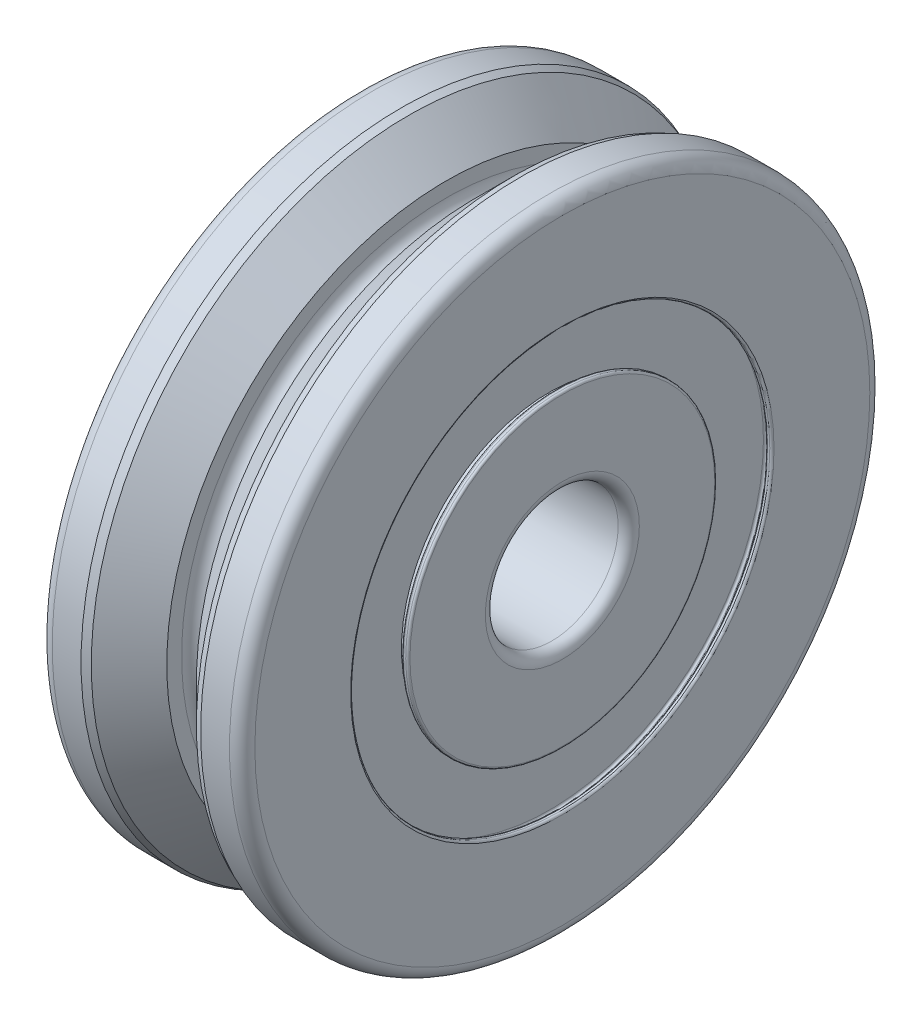
ISO-10303-21;
HEADER;
FILE_DESCRIPTION(('STEP AP214'),'2;1');
FILE_NAME('part.step','',(''),(''),'','','');
FILE_SCHEMA(('AUTOMOTIVE_DESIGN { 1 0 10303 214 1 1 1 1 }'));
ENDSEC;
DATA;
#1=APPLICATION_CONTEXT('core data for automotive mechanical design processes');
#2=APPLICATION_PROTOCOL_DEFINITION('international standard','automotive_design',2000,#1);
#3=PRODUCT_CONTEXT('',#1,'mechanical');
#4=PRODUCT('Part','Part','',(#3));
#5=PRODUCT_RELATED_PRODUCT_CATEGORY('part','',(#4));
#6=PRODUCT_DEFINITION_FORMATION('','',#4);
#7=PRODUCT_DEFINITION_CONTEXT('part definition',#1,'design');
#8=PRODUCT_DEFINITION('design','',#6,#7);
#9=PRODUCT_DEFINITION_SHAPE('','',#8);
#10=(LENGTH_UNIT() NAMED_UNIT(*) SI_UNIT(.MILLI.,.METRE.));
#11=(NAMED_UNIT(*) PLANE_ANGLE_UNIT() SI_UNIT($,.RADIAN.));
#12=(NAMED_UNIT(*) SI_UNIT($,.STERADIAN.) SOLID_ANGLE_UNIT());
#13=UNCERTAINTY_MEASURE_WITH_UNIT(LENGTH_MEASURE(1.E-05),#10,'distance_accuracy_value','');
#14=(GEOMETRIC_REPRESENTATION_CONTEXT(3) GLOBAL_UNCERTAINTY_ASSIGNED_CONTEXT((#13)) GLOBAL_UNIT_ASSIGNED_CONTEXT((#10,
#11,#12)) REPRESENTATION_CONTEXT('',''));
#15=CARTESIAN_POINT('',(0.,0.,0.));
#16=DIRECTION('',(0.,0.,1.));
#17=DIRECTION('',(1.,0.,0.));
#18=AXIS2_PLACEMENT_3D('',#15,#16,#17);
#19=CARTESIAN_POINT('',(-4.76250000000015,0.,0.));
#20=DIRECTION('',(1.,0.,0.));
#21=DIRECTION('',(0.,0.,-1.));
#22=AXIS2_PLACEMENT_3D('',#19,#20,#21);
#23=TOROIDAL_SURFACE('',#22,7.3152,0.101599999999924);
#24=CARTESIAN_POINT('',(-4.8641,0.,0.));
#25=DIRECTION('',(1.,0.,0.));
#26=DIRECTION('',(0.,0.,-1.));
#27=AXIS2_PLACEMENT_3D('',#24,#25,#26);
#28=CIRCLE('',#27,7.3152);
#29=CARTESIAN_POINT('',(-4.8641,0.,-7.3152));
#30=VERTEX_POINT('',#29);
#31=EDGE_CURVE('E10',#30,#30,#28,.T.);
#32=ORIENTED_EDGE('',*,*,#31,.T.);
#33=EDGE_LOOP('',(#32));
#34=FACE_BOUND('',#33,.T.);
#35=CARTESIAN_POINT('',(-4.7625,0.,0.));
#36=DIRECTION('',(1.,0.,0.));
#37=DIRECTION('',(0.,0.,-1.));
#38=AXIS2_PLACEMENT_3D('',#35,#36,#37);
#39=CIRCLE('',#38,7.4168);
#40=CARTESIAN_POINT('',(-4.7625,0.,-7.4168));
#41=VERTEX_POINT('',#40);
#42=EDGE_CURVE('E164',#41,#41,#39,.T.);
#43=ORIENTED_EDGE('',*,*,#42,.F.);
#44=EDGE_LOOP('',(#43));
#45=FACE_BOUND('',#44,.T.);
#46=ADVANCED_FACE('F34',(#34,#45),#23,.T.);
#47=CARTESIAN_POINT('',(-4.86410000000005,7.3152,0.));
#48=DIRECTION('',(-1.,0.,0.));
#49=DIRECTION('',(0.,0.,1.));
#50=AXIS2_PLACEMENT_3D('',#47,#48,#49);
#51=PLANE('',#50);
#52=CARTESIAN_POINT('',(-4.86410000000009,0.,0.));
#53=DIRECTION('',(1.,0.,0.));
#54=DIRECTION('',(0.,0.,-1.));
#55=AXIS2_PLACEMENT_3D('',#52,#53,#54);
#56=CIRCLE('',#55,3.6957);
#57=CARTESIAN_POINT('',(-4.86410000000009,0.,-3.6957));
#58=VERTEX_POINT('',#57);
#59=EDGE_CURVE('E40',#58,#58,#56,.T.);
#60=ORIENTED_EDGE('',*,*,#59,.T.);
#61=EDGE_LOOP('',(#60));
#62=FACE_BOUND('',#61,.T.);
#63=ORIENTED_EDGE('',*,*,#31,.F.);
#64=EDGE_LOOP('',(#63));
#65=FACE_BOUND('',#64,.T.);
#66=ADVANCED_FACE('F172',(#62,#65),#51,.T.);
#67=CARTESIAN_POINT('',(-4.35610000000013,0.,0.));
#68=DIRECTION('',(1.,0.,0.));
#69=DIRECTION('',(0.,0.,-1.));
#70=AXIS2_PLACEMENT_3D('',#67,#68,#69);
#71=TOROIDAL_SURFACE('',#70,3.6957,0.507999999999968);
#72=CARTESIAN_POINT('',(-4.3561,0.,0.));
#73=DIRECTION('',(1.,0.,0.));
#74=DIRECTION('',(0.,0.,-1.));
#75=AXIS2_PLACEMENT_3D('',#72,#73,#74);
#76=CIRCLE('',#75,3.1877);
#77=CARTESIAN_POINT('',(-4.3561,0.,-3.1877));
#78=VERTEX_POINT('',#77);
#79=EDGE_CURVE('E44',#78,#78,#76,.T.);
#80=ORIENTED_EDGE('',*,*,#79,.T.);
#81=EDGE_LOOP('',(#80));
#82=FACE_BOUND('',#81,.T.);
#83=ORIENTED_EDGE('',*,*,#59,.F.);
#84=EDGE_LOOP('',(#83));
#85=FACE_BOUND('',#84,.T.);
#86=ADVANCED_FACE('F176',(#82,#85),#71,.T.);
#87=CARTESIAN_POINT('',(-4.86410000000084,0.,0.));
#88=DIRECTION('',(1.,0.,0.));
#89=DIRECTION('',(0.,0.,-1.));
#90=AXIS2_PLACEMENT_3D('',#87,#88,#89);
#91=CYLINDRICAL_SURFACE('',#90,3.18770000000002);
#92=CARTESIAN_POINT('',(4.35609999999933,0.,0.));
#93=DIRECTION('',(1.,0.,0.));
#94=DIRECTION('',(0.,0.,-1.));
#95=AXIS2_PLACEMENT_3D('',#92,#93,#94);
#96=CIRCLE('',#95,3.18770000000003);
#97=CARTESIAN_POINT('',(4.35609999999933,0.,-3.18770000000003));
#98=VERTEX_POINT('',#97);
#99=EDGE_CURVE('E48',#98,#98,#96,.T.);
#100=ORIENTED_EDGE('',*,*,#99,.T.);
#101=EDGE_LOOP('',(#100));
#102=FACE_BOUND('',#101,.T.);
#103=ORIENTED_EDGE('',*,*,#79,.F.);
#104=EDGE_LOOP('',(#103));
#105=FACE_BOUND('',#104,.T.);
#106=ADVANCED_FACE('F180',(#102,#105),#91,.F.);
#107=CARTESIAN_POINT('',(4.35609999999933,0.,0.));
#108=DIRECTION('',(1.,0.,0.));
#109=DIRECTION('',(0.,0.,-1.));
#110=AXIS2_PLACEMENT_3D('',#107,#108,#109);
#111=TOROIDAL_SURFACE('',#110,3.69569999999997,0.507999999999936);
#112=CARTESIAN_POINT('',(4.86409999999927,0.,0.));
#113=DIRECTION('',(1.,0.,0.));
#114=DIRECTION('',(0.,0.,-1.));
#115=AXIS2_PLACEMENT_3D('',#112,#113,#114);
#116=CIRCLE('',#115,3.69569999999997);
#117=CARTESIAN_POINT('',(4.86409999999927,0.,-3.69569999999997));
#118=VERTEX_POINT('',#117);
#119=EDGE_CURVE('E53',#118,#118,#116,.T.);
#120=ORIENTED_EDGE('',*,*,#119,.T.);
#121=EDGE_LOOP('',(#120));
#122=FACE_BOUND('',#121,.T.);
#123=ORIENTED_EDGE('',*,*,#99,.F.);
#124=EDGE_LOOP('',(#123));
#125=FACE_BOUND('',#124,.T.);
#126=ADVANCED_FACE('F187',(#122,#125),#111,.T.);
#127=CARTESIAN_POINT('',(4.86409999999927,3.69569999999997,0.));
#128=DIRECTION('',(1.,0.,0.));
#129=DIRECTION('',(0.,0.,-1.));
#130=AXIS2_PLACEMENT_3D('',#127,#128,#129);
#131=PLANE('',#130);
#132=CARTESIAN_POINT('',(4.86409999999927,0.,0.));
#133=DIRECTION('',(1.,0.,0.));
#134=DIRECTION('',(0.,0.,-1.));
#135=AXIS2_PLACEMENT_3D('',#132,#133,#134);
#136=CIRCLE('',#135,7.31519999999992);
#137=CARTESIAN_POINT('',(4.86409999999927,0.,-7.31519999999992));
#138=VERTEX_POINT('',#137);
#139=EDGE_CURVE('E56',#138,#138,#136,.T.);
#140=ORIENTED_EDGE('',*,*,#139,.T.);
#141=EDGE_LOOP('',(#140));
#142=FACE_BOUND('',#141,.T.);
#143=ORIENTED_EDGE('',*,*,#119,.F.);
#144=EDGE_LOOP('',(#143));
#145=FACE_BOUND('',#144,.T.);
#146=ADVANCED_FACE('F191',(#142,#145),#131,.T.);
#147=CARTESIAN_POINT('',(4.76249999999927,0.,0.));
#148=DIRECTION('',(1.,0.,0.));
#149=DIRECTION('',(0.,0.,-1.));
#150=AXIS2_PLACEMENT_3D('',#147,#148,#149);
#151=TOROIDAL_SURFACE('',#150,7.31519999999992,0.101600000000001);
#152=CARTESIAN_POINT('',(4.76249999999927,0.,0.));
#153=DIRECTION('',(1.,0.,0.));
#154=DIRECTION('',(0.,0.,-1.));
#155=AXIS2_PLACEMENT_3D('',#152,#153,#154);
#156=CIRCLE('',#155,7.41679999999993);
#157=CARTESIAN_POINT('',(4.76249999999927,0.,-7.41679999999993));
#158=VERTEX_POINT('',#157);
#159=EDGE_CURVE('E59',#158,#158,#156,.T.);
#160=ORIENTED_EDGE('',*,*,#159,.T.);
#161=EDGE_LOOP('',(#160));
#162=FACE_BOUND('',#161,.T.);
#163=ORIENTED_EDGE('',*,*,#139,.F.);
#164=EDGE_LOOP('',(#163));
#165=FACE_BOUND('',#164,.T.);
#166=ADVANCED_FACE('F195',(#162,#165),#151,.T.);
#167=CARTESIAN_POINT('',(-4.86410000000084,0.,0.));
#168=DIRECTION('',(1.,0.,0.));
#169=DIRECTION('',(0.,0.,-1.));
#170=AXIS2_PLACEMENT_3D('',#167,#168,#169);
#171=CYLINDRICAL_SURFACE('',#170,7.41679999999996);
#172=CARTESIAN_POINT('',(4.6609,0.,0.));
#173=DIRECTION('',(1.,0.,0.));
#174=DIRECTION('',(0.,0.,-1.));
#175=AXIS2_PLACEMENT_3D('',#172,#173,#174);
#176=CIRCLE('',#175,7.4168);
#177=CARTESIAN_POINT('',(4.6609,0.,-7.4168));
#178=VERTEX_POINT('',#177);
#179=EDGE_CURVE('E62',#178,#178,#176,.T.);
#180=ORIENTED_EDGE('',*,*,#179,.T.);
#181=EDGE_LOOP('',(#180));
#182=FACE_BOUND('',#181,.T.);
#183=ORIENTED_EDGE('',*,*,#159,.F.);
#184=EDGE_LOOP('',(#183));
#185=FACE_BOUND('',#184,.T.);
#186=ADVANCED_FACE('F199',(#182,#185),#171,.T.);
#187=CARTESIAN_POINT('',(4.6609,0.,0.));
#188=DIRECTION('',(1.,0.,0.));
#189=DIRECTION('',(0.,0.,-1.));
#190=AXIS2_PLACEMENT_3D('',#187,#188,#189);
#191=TOROIDAL_SURFACE('',#190,7.3152,0.1016);
#192=CARTESIAN_POINT('',(4.5593,0.,0.));
#193=DIRECTION('',(1.,0.,0.));
#194=DIRECTION('',(0.,0.,-1.));
#195=AXIS2_PLACEMENT_3D('',#192,#193,#194);
#196=CIRCLE('',#195,7.3152);
#197=CARTESIAN_POINT('',(4.5593,0.,-7.3152));
#198=VERTEX_POINT('',#197);
#199=EDGE_CURVE('E65',#198,#198,#196,.T.);
#200=ORIENTED_EDGE('',*,*,#199,.T.);
#201=EDGE_LOOP('',(#200));
#202=FACE_BOUND('',#201,.T.);
#203=ORIENTED_EDGE('',*,*,#179,.F.);
#204=EDGE_LOOP('',(#203));
#205=FACE_BOUND('',#204,.T.);
#206=ADVANCED_FACE('F203',(#202,#205),#191,.T.);
#207=CARTESIAN_POINT('',(4.5593,7.3152,0.));
#208=DIRECTION('',(-1.,0.,0.));
#209=DIRECTION('',(0.,0.,1.));
#210=AXIS2_PLACEMENT_3D('',#207,#208,#209);
#211=PLANE('',#210);
#212=CARTESIAN_POINT('',(4.5593,0.,0.));
#213=DIRECTION('',(1.,0.,0.));
#214=DIRECTION('',(0.,0.,-1.));
#215=AXIS2_PLACEMENT_3D('',#212,#213,#214);
#216=CIRCLE('',#215,7.112);
#217=CARTESIAN_POINT('',(4.5593,0.,-7.112));
#218=VERTEX_POINT('',#217);
#219=EDGE_CURVE('E68',#218,#218,#216,.T.);
#220=ORIENTED_EDGE('',*,*,#219,.T.);
#221=EDGE_LOOP('',(#220));
#222=FACE_BOUND('',#221,.T.);
#223=ORIENTED_EDGE('',*,*,#199,.F.);
#224=EDGE_LOOP('',(#223));
#225=FACE_BOUND('',#224,.T.);
#226=ADVANCED_FACE('F207',(#222,#225),#211,.T.);
#227=CARTESIAN_POINT('',(-4.86410000000084,0.,0.));
#228=DIRECTION('',(1.,0.,0.));
#229=DIRECTION('',(0.,0.,-1.));
#230=AXIS2_PLACEMENT_3D('',#227,#228,#229);
#231=CYLINDRICAL_SURFACE('',#230,7.112);
#232=CARTESIAN_POINT('',(4.25449999999937,0.,0.));
#233=DIRECTION('',(1.,0.,0.));
#234=DIRECTION('',(0.,0.,-1.));
#235=AXIS2_PLACEMENT_3D('',#232,#233,#234);
#236=CIRCLE('',#235,7.112);
#237=CARTESIAN_POINT('',(4.25449999999937,0.,-7.112));
#238=VERTEX_POINT('',#237);
#239=EDGE_CURVE('E71',#238,#238,#236,.T.);
#240=ORIENTED_EDGE('',*,*,#239,.T.);
#241=EDGE_LOOP('',(#240));
#242=FACE_BOUND('',#241,.T.);
#243=ORIENTED_EDGE('',*,*,#219,.F.);
#244=EDGE_LOOP('',(#243));
#245=FACE_BOUND('',#244,.T.);
#246=ADVANCED_FACE('F211',(#242,#245),#231,.T.);
#247=CARTESIAN_POINT('',(4.25449999999937,7.112,0.));
#248=DIRECTION('',(1.,0.,0.));
#249=DIRECTION('',(0.,0.,-1.));
#250=AXIS2_PLACEMENT_3D('',#247,#248,#249);
#251=PLANE('',#250);
#252=CARTESIAN_POINT('',(4.25449999999937,0.,0.));
#253=DIRECTION('',(1.,0.,0.));
#254=DIRECTION('',(0.,0.,-1.));
#255=AXIS2_PLACEMENT_3D('',#252,#253,#254);
#256=CIRCLE('',#255,10.2616000000002);
#257=CARTESIAN_POINT('',(4.25449999999937,0.,-10.2616000000002));
#258=VERTEX_POINT('',#257);
#259=EDGE_CURVE('E74',#258,#258,#256,.T.);
#260=ORIENTED_EDGE('',*,*,#259,.T.);
#261=EDGE_LOOP('',(#260));
#262=FACE_BOUND('',#261,.T.);
#263=ORIENTED_EDGE('',*,*,#239,.F.);
#264=EDGE_LOOP('',(#263));
#265=FACE_BOUND('',#264,.T.);
#266=ADVANCED_FACE('F215',(#262,#265),#251,.T.);
#267=CARTESIAN_POINT('',(4.35609999999916,0.,0.));
#268=DIRECTION('',(1.,0.,0.));
#269=DIRECTION('',(0.,0.,-1.));
#270=AXIS2_PLACEMENT_3D('',#267,#268,#269);
#271=TOROIDAL_SURFACE('',#270,10.2616000000002,0.10159999999979);
#272=CARTESIAN_POINT('',(4.35609999999916,0.,0.));
#273=DIRECTION('',(1.,0.,0.));
#274=DIRECTION('',(0.,0.,-1.));
#275=AXIS2_PLACEMENT_3D('',#272,#273,#274);
#276=CIRCLE('',#275,10.3632);
#277=CARTESIAN_POINT('',(4.35609999999916,0.,-10.3632));
#278=VERTEX_POINT('',#277);
#279=EDGE_CURVE('E77',#278,#278,#276,.T.);
#280=ORIENTED_EDGE('',*,*,#279,.T.);
#281=EDGE_LOOP('',(#280));
#282=FACE_BOUND('',#281,.T.);
#283=ORIENTED_EDGE('',*,*,#259,.F.);
#284=EDGE_LOOP('',(#283));
#285=FACE_BOUND('',#284,.T.);
#286=ADVANCED_FACE('F219',(#282,#285),#271,.F.);
#287=CARTESIAN_POINT('',(-4.86410000000084,0.,0.));
#288=DIRECTION('',(1.,0.,0.));
#289=DIRECTION('',(0.,0.,-1.));
#290=AXIS2_PLACEMENT_3D('',#287,#288,#289);
#291=CYLINDRICAL_SURFACE('',#290,10.3632);
#292=CARTESIAN_POINT('',(4.5593,0.,0.));
#293=DIRECTION('',(1.,0.,0.));
#294=DIRECTION('',(0.,0.,-1.));
#295=AXIS2_PLACEMENT_3D('',#292,#293,#294);
#296=CIRCLE('',#295,10.3632);
#297=CARTESIAN_POINT('',(4.5593,0.,-10.3632));
#298=VERTEX_POINT('',#297);
#299=EDGE_CURVE('E80',#298,#298,#296,.T.);
#300=ORIENTED_EDGE('',*,*,#299,.T.);
#301=EDGE_LOOP('',(#300));
#302=FACE_BOUND('',#301,.T.);
#303=ORIENTED_EDGE('',*,*,#279,.F.);
#304=EDGE_LOOP('',(#303));
#305=FACE_BOUND('',#304,.T.);
#306=ADVANCED_FACE('F223',(#302,#305),#291,.F.);
#307=CARTESIAN_POINT('',(4.5593,10.3632,0.));
#308=DIRECTION('',(-1.,0.,0.));
#309=DIRECTION('',(0.,0.,1.));
#310=AXIS2_PLACEMENT_3D('',#307,#308,#309);
#311=PLANE('',#310);
#312=CARTESIAN_POINT('',(4.5593,0.,0.));
#313=DIRECTION('',(1.,0.,0.));
#314=DIRECTION('',(0.,0.,-1.));
#315=AXIS2_PLACEMENT_3D('',#312,#313,#314);
#316=CIRCLE('',#315,10.16);
#317=CARTESIAN_POINT('',(4.5593,0.,-10.16));
#318=VERTEX_POINT('',#317);
#319=EDGE_CURVE('E83',#318,#318,#316,.T.);
#320=ORIENTED_EDGE('',*,*,#319,.T.);
#321=EDGE_LOOP('',(#320));
#322=FACE_BOUND('',#321,.T.);
#323=ORIENTED_EDGE('',*,*,#299,.F.);
#324=EDGE_LOOP('',(#323));
#325=FACE_BOUND('',#324,.T.);
#326=ADVANCED_FACE('F227',(#322,#325),#311,.T.);
#327=CARTESIAN_POINT('',(4.66089999999979,0.,0.));
#328=DIRECTION('',(1.,0.,0.));
#329=DIRECTION('',(0.,0.,-1.));
#330=AXIS2_PLACEMENT_3D('',#327,#328,#329);
#331=TOROIDAL_SURFACE('',#330,10.16,0.10159999999979);
#332=CARTESIAN_POINT('',(4.66089999999979,0.,0.));
#333=DIRECTION('',(1.,0.,0.));
#334=DIRECTION('',(0.,0.,-1.));
#335=AXIS2_PLACEMENT_3D('',#332,#333,#334);
#336=CIRCLE('',#335,10.0584000000002);
#337=CARTESIAN_POINT('',(4.66089999999979,0.,-10.0584000000002));
#338=VERTEX_POINT('',#337);
#339=EDGE_CURVE('E86',#338,#338,#336,.T.);
#340=ORIENTED_EDGE('',*,*,#339,.T.);
#341=EDGE_LOOP('',(#340));
#342=FACE_BOUND('',#341,.T.);
#343=ORIENTED_EDGE('',*,*,#319,.F.);
#344=EDGE_LOOP('',(#343));
#345=FACE_BOUND('',#344,.T.);
#346=ADVANCED_FACE('F231',(#342,#345),#331,.T.);
#347=CARTESIAN_POINT('',(-4.86410000000084,0.,0.));
#348=DIRECTION('',(1.,0.,0.));
#349=DIRECTION('',(0.,0.,-1.));
#350=AXIS2_PLACEMENT_3D('',#347,#348,#349);
#351=CYLINDRICAL_SURFACE('',#350,10.0584000000002);
#352=CARTESIAN_POINT('',(4.76249999999969,0.,0.));
#353=DIRECTION('',(1.,0.,0.));
#354=DIRECTION('',(0.,0.,-1.));
#355=AXIS2_PLACEMENT_3D('',#352,#353,#354);
#356=CIRCLE('',#355,10.0584000000002);
#357=CARTESIAN_POINT('',(4.76249999999969,0.,-10.0584000000002));
#358=VERTEX_POINT('',#357);
#359=EDGE_CURVE('E89',#358,#358,#356,.T.);
#360=ORIENTED_EDGE('',*,*,#359,.T.);
#361=EDGE_LOOP('',(#360));
#362=FACE_BOUND('',#361,.T.);
#363=ORIENTED_EDGE('',*,*,#339,.F.);
#364=EDGE_LOOP('',(#363));
#365=FACE_BOUND('',#364,.T.);
#366=ADVANCED_FACE('F235',(#362,#365),#351,.F.);
#367=CARTESIAN_POINT('',(4.76249999999969,0.,0.));
#368=DIRECTION('',(1.,0.,0.));
#369=DIRECTION('',(0.,0.,-1.));
#370=AXIS2_PLACEMENT_3D('',#367,#368,#369);
#371=TOROIDAL_SURFACE('',#370,10.1599999999998,0.10159999999958);
#372=CARTESIAN_POINT('',(4.86409999999927,0.,0.));
#373=DIRECTION('',(1.,0.,0.));
#374=DIRECTION('',(0.,0.,-1.));
#375=AXIS2_PLACEMENT_3D('',#372,#373,#374);
#376=CIRCLE('',#375,10.1599999999998);
#377=CARTESIAN_POINT('',(4.86409999999927,0.,-10.1599999999998));
#378=VERTEX_POINT('',#377);
#379=EDGE_CURVE('E92',#378,#378,#376,.T.);
#380=ORIENTED_EDGE('',*,*,#379,.T.);
#381=EDGE_LOOP('',(#380));
#382=FACE_BOUND('',#381,.T.);
#383=ORIENTED_EDGE('',*,*,#359,.F.);
#384=EDGE_LOOP('',(#383));
#385=FACE_BOUND('',#384,.T.);
#386=ADVANCED_FACE('F239',(#382,#385),#371,.T.);
#387=CARTESIAN_POINT('',(4.86409999999927,10.1599999999998,0.));
#388=DIRECTION('',(1.,0.,0.));
#389=DIRECTION('',(0.,0.,-1.));
#390=AXIS2_PLACEMENT_3D('',#387,#388,#389);
#391=PLANE('',#390);
#392=CARTESIAN_POINT('',(4.86409999999927,0.,0.));
#393=DIRECTION('',(1.,0.,0.));
#394=DIRECTION('',(0.,0.,-1.));
#395=AXIS2_PLACEMENT_3D('',#392,#393,#394);
#396=CIRCLE('',#395,14.7574000000001);
#397=CARTESIAN_POINT('',(4.86409999999927,0.,-14.7574000000001));
#398=VERTEX_POINT('',#397);
#399=EDGE_CURVE('E95',#398,#398,#396,.T.);
#400=ORIENTED_EDGE('',*,*,#399,.T.);
#401=EDGE_LOOP('',(#400));
#402=FACE_BOUND('',#401,.T.);
#403=ORIENTED_EDGE('',*,*,#379,.F.);
#404=EDGE_LOOP('',(#403));
#405=FACE_BOUND('',#404,.T.);
#406=ADVANCED_FACE('F243',(#402,#405),#391,.T.);
#407=CARTESIAN_POINT('',(4.25449999999912,0.,0.));
#408=DIRECTION('',(1.,0.,0.));
#409=DIRECTION('',(0.,0.,-1.));
#410=AXIS2_PLACEMENT_3D('',#407,#408,#409);
#411=TOROIDAL_SURFACE('',#410,14.7574000000001,0.609600000000146);
#412=CARTESIAN_POINT('',(4.25449999999912,0.,0.));
#413=DIRECTION('',(1.,0.,0.));
#414=DIRECTION('',(0.,0.,-1.));
#415=AXIS2_PLACEMENT_3D('',#412,#413,#414);
#416=CIRCLE('',#415,15.3670000000003);
#417=CARTESIAN_POINT('',(4.25449999999912,0.,-15.3670000000003));
#418=VERTEX_POINT('',#417);
#419=EDGE_CURVE('E98',#418,#418,#416,.T.);
#420=ORIENTED_EDGE('',*,*,#419,.T.);
#421=EDGE_LOOP('',(#420));
#422=FACE_BOUND('',#421,.T.);
#423=ORIENTED_EDGE('',*,*,#399,.F.);
#424=EDGE_LOOP('',(#423));
#425=FACE_BOUND('',#424,.T.);
#426=ADVANCED_FACE('F247',(#422,#425),#411,.T.);
#427=CARTESIAN_POINT('',(-4.86410000000084,0.,0.));
#428=DIRECTION('',(1.,0.,0.));
#429=DIRECTION('',(0.,0.,-1.));
#430=AXIS2_PLACEMENT_3D('',#427,#428,#429);
#431=CYLINDRICAL_SURFACE('',#430,15.3670000000003);
#432=CARTESIAN_POINT('',(2.86990403026701,0.,0.));
#433=DIRECTION('',(1.,0.,0.));
#434=DIRECTION('',(0.,0.,-1.));
#435=AXIS2_PLACEMENT_3D('',#432,#433,#434);
#436=CIRCLE('',#435,15.3670000000003);
#437=CARTESIAN_POINT('',(2.86990403026701,0.,-15.3670000000003));
#438=VERTEX_POINT('',#437);
#439=EDGE_CURVE('E101',#438,#438,#436,.T.);
#440=ORIENTED_EDGE('',*,*,#439,.T.);
#441=EDGE_LOOP('',(#440));
#442=FACE_BOUND('',#441,.T.);
#443=ORIENTED_EDGE('',*,*,#419,.F.);
#444=EDGE_LOOP('',(#443));
#445=FACE_BOUND('',#444,.T.);
#446=ADVANCED_FACE('F251',(#442,#445),#431,.T.);
#447=CARTESIAN_POINT('',(2.86990403026701,0.,0.));
#448=DIRECTION('',(1.,0.,0.));
#449=DIRECTION('',(0.,0.,-1.));
#450=AXIS2_PLACEMENT_3D('',#447,#448,#449);
#451=CONICAL_SURFACE('',#450,15.3670000000003,0.392699078605454);
#452=CARTESIAN_POINT('',(2.52301993232991,0.,0.));
#453=DIRECTION('',(1.,0.,0.));
#454=DIRECTION('',(0.,0.,-1.));
#455=AXIS2_PLACEMENT_3D('',#452,#453,#454);
#456=CIRCLE('',#455,15.2233159033203);
#457=CARTESIAN_POINT('',(2.52301993232991,0.,-15.2233159033203));
#458=VERTEX_POINT('',#457);
#459=EDGE_CURVE('E104',#458,#458,#456,.T.);
#460=ORIENTED_EDGE('',*,*,#459,.T.);
#461=EDGE_LOOP('',(#460));
#462=FACE_BOUND('',#461,.T.);
#463=ORIENTED_EDGE('',*,*,#439,.F.);
#464=EDGE_LOOP('',(#463));
#465=FACE_BOUND('',#464,.T.);
#466=ADVANCED_FACE('F255',(#462,#465),#451,.T.);
#467=CARTESIAN_POINT('',(2.52301993232991,0.,0.));
#468=DIRECTION('',(1.,0.,0.));
#469=DIRECTION('',(0.,0.,-1.));
#470=AXIS2_PLACEMENT_3D('',#467,#468,#469);
#471=CONICAL_SURFACE('',#470,15.2233159033203,0.785398163397449);
#472=CARTESIAN_POINT('',(0.71119999998481,0.,0.));
#473=DIRECTION('',(1.,0.,0.));
#474=DIRECTION('',(0.,0.,-1.));
#475=AXIS2_PLACEMENT_3D('',#472,#473,#474);
#476=CIRCLE('',#475,13.4114959709752);
#477=CARTESIAN_POINT('',(0.71119999998481,0.,-13.4114959709752));
#478=VERTEX_POINT('',#477);
#479=EDGE_CURVE('E107',#478,#478,#476,.T.);
#480=ORIENTED_EDGE('',*,*,#479,.T.);
#481=EDGE_LOOP('',(#480));
#482=FACE_BOUND('',#481,.T.);
#483=ORIENTED_EDGE('',*,*,#459,.F.);
#484=EDGE_LOOP('',(#483));
#485=FACE_BOUND('',#484,.T.);
#486=ADVANCED_FACE('F259',(#482,#485),#471,.T.);
#487=CARTESIAN_POINT('',(0.71119999998481,13.4114959709752,0.));
#488=DIRECTION('',(-1.,0.,0.));
#489=DIRECTION('',(0.,0.,1.));
#490=AXIS2_PLACEMENT_3D('',#487,#488,#489);
#491=PLANE('',#490);
#492=CARTESIAN_POINT('',(0.71119999998481,0.,0.));
#493=DIRECTION('',(1.,0.,0.));
#494=DIRECTION('',(0.,0.,-1.));
#495=AXIS2_PLACEMENT_3D('',#492,#493,#494);
#496=CIRCLE('',#495,12.7000000254152);
#497=CARTESIAN_POINT('',(0.71119999998481,0.,-12.7000000254152));
#498=VERTEX_POINT('',#497);
#499=EDGE_CURVE('E110',#498,#498,#496,.T.);
#500=ORIENTED_EDGE('',*,*,#499,.T.);
#501=EDGE_LOOP('',(#500));
#502=FACE_BOUND('',#501,.T.);
#503=ORIENTED_EDGE('',*,*,#479,.F.);
#504=EDGE_LOOP('',(#503));
#505=FACE_BOUND('',#504,.T.);
#506=ADVANCED_FACE('F263',(#502,#505),#491,.T.);
#507=CARTESIAN_POINT('',(-2.9024092157437E-13,0.,0.));
#508=DIRECTION('',(1.,0.,0.));
#509=DIRECTION('',(0.,0.,-1.));
#510=AXIS2_PLACEMENT_3D('',#507,#508,#509);
#511=TOROIDAL_SURFACE('',#510,12.7000000254152,0.7111999999851);
#512=CARTESIAN_POINT('',(-0.711199999985391,0.,0.));
#513=DIRECTION('',(1.,0.,0.));
#514=DIRECTION('',(0.,0.,-1.));
#515=AXIS2_PLACEMENT_3D('',#512,#513,#514);
#516=CIRCLE('',#515,12.7000000254152);
#517=CARTESIAN_POINT('',(-0.711199999985391,0.,-12.7000000254152));
#518=VERTEX_POINT('',#517);
#519=EDGE_CURVE('E113',#518,#518,#516,.T.);
#520=ORIENTED_EDGE('',*,*,#519,.T.);
#521=EDGE_LOOP('',(#520));
#522=FACE_BOUND('',#521,.T.);
#523=ORIENTED_EDGE('',*,*,#499,.F.);
#524=EDGE_LOOP('',(#523));
#525=FACE_BOUND('',#524,.T.);
#526=ADVANCED_FACE('F267',(#522,#525),#511,.F.);
#527=CARTESIAN_POINT('',(-0.711199999985391,12.7000000254152,0.));
#528=DIRECTION('',(1.,0.,0.));
#529=DIRECTION('',(0.,0.,-1.));
#530=AXIS2_PLACEMENT_3D('',#527,#528,#529);
#531=PLANE('',#530);
#532=CARTESIAN_POINT('',(-0.711199999985391,0.,0.));
#533=DIRECTION('',(1.,0.,0.));
#534=DIRECTION('',(0.,0.,-1.));
#535=AXIS2_PLACEMENT_3D('',#532,#533,#534);
#536=CIRCLE('',#535,13.4114959709752);
#537=CARTESIAN_POINT('',(-0.711199999985391,0.,-13.4114959709752));
#538=VERTEX_POINT('',#537);
#539=EDGE_CURVE('E116',#538,#538,#536,.T.);
#540=ORIENTED_EDGE('',*,*,#539,.T.);
#541=EDGE_LOOP('',(#540));
#542=FACE_BOUND('',#541,.T.);
#543=ORIENTED_EDGE('',*,*,#519,.F.);
#544=EDGE_LOOP('',(#543));
#545=FACE_BOUND('',#544,.T.);
#546=ADVANCED_FACE('F271',(#542,#545),#531,.T.);
#547=CARTESIAN_POINT('',(-0.711199999985391,0.,0.));
#548=DIRECTION('',(-1.,0.,0.));
#549=DIRECTION('',(0.,0.,1.));
#550=AXIS2_PLACEMENT_3D('',#547,#548,#549);
#551=CONICAL_SURFACE('',#550,13.4114959709752,0.785398163397448);
#552=CARTESIAN_POINT('',(-2.52301993233049,0.,0.));
#553=DIRECTION('',(1.,0.,0.));
#554=DIRECTION('',(0.,0.,-1.));
#555=AXIS2_PLACEMENT_3D('',#552,#553,#554);
#556=CIRCLE('',#555,15.2233159033203);
#557=CARTESIAN_POINT('',(-2.52301993233049,0.,-15.2233159033203));
#558=VERTEX_POINT('',#557);
#559=EDGE_CURVE('E119',#558,#558,#556,.T.);
#560=ORIENTED_EDGE('',*,*,#559,.T.);
#561=EDGE_LOOP('',(#560));
#562=FACE_BOUND('',#561,.T.);
#563=ORIENTED_EDGE('',*,*,#539,.F.);
#564=EDGE_LOOP('',(#563));
#565=FACE_BOUND('',#564,.T.);
#566=ADVANCED_FACE('F275',(#562,#565),#551,.T.);
#567=CARTESIAN_POINT('',(-2.52301993233049,0.,0.));
#568=DIRECTION('',(-1.,0.,0.));
#569=DIRECTION('',(0.,0.,1.));
#570=AXIS2_PLACEMENT_3D('',#567,#568,#569);
#571=CONICAL_SURFACE('',#570,15.2233159033203,0.392699078605448);
#572=CARTESIAN_POINT('',(-2.86990403026759,0.,0.));
#573=DIRECTION('',(1.,0.,0.));
#574=DIRECTION('',(0.,0.,-1.));
#575=AXIS2_PLACEMENT_3D('',#572,#573,#574);
#576=CIRCLE('',#575,15.3670000000003);
#577=CARTESIAN_POINT('',(-2.86990403026759,0.,-15.3670000000003));
#578=VERTEX_POINT('',#577);
#579=EDGE_CURVE('E122',#578,#578,#576,.T.);
#580=ORIENTED_EDGE('',*,*,#579,.T.);
#581=EDGE_LOOP('',(#580));
#582=FACE_BOUND('',#581,.T.);
#583=ORIENTED_EDGE('',*,*,#559,.F.);
#584=EDGE_LOOP('',(#583));
#585=FACE_BOUND('',#584,.T.);
#586=ADVANCED_FACE('F279',(#582,#585),#571,.T.);
#587=CARTESIAN_POINT('',(-4.86410000000084,0.,0.));
#588=DIRECTION('',(1.,0.,0.));
#589=DIRECTION('',(0.,0.,-1.));
#590=AXIS2_PLACEMENT_3D('',#587,#588,#589);
#591=CYLINDRICAL_SURFACE('',#590,15.3670000000003);
#592=CARTESIAN_POINT('',(-4.25449999999971,0.,0.));
#593=DIRECTION('',(1.,0.,0.));
#594=DIRECTION('',(0.,0.,-1.));
#595=AXIS2_PLACEMENT_3D('',#592,#593,#594);
#596=CIRCLE('',#595,15.3670000000003);
#597=CARTESIAN_POINT('',(-4.25449999999971,0.,-15.3670000000003));
#598=VERTEX_POINT('',#597);
#599=EDGE_CURVE('E125',#598,#598,#596,.T.);
#600=ORIENTED_EDGE('',*,*,#599,.T.);
#601=EDGE_LOOP('',(#600));
#602=FACE_BOUND('',#601,.T.);
#603=ORIENTED_EDGE('',*,*,#579,.F.);
#604=EDGE_LOOP('',(#603));
#605=FACE_BOUND('',#604,.T.);
#606=ADVANCED_FACE('F283',(#602,#605),#591,.T.);
#607=CARTESIAN_POINT('',(-4.25449999999971,0.,0.));
#608=DIRECTION('',(1.,0.,0.));
#609=DIRECTION('',(0.,0.,-1.));
#610=AXIS2_PLACEMENT_3D('',#607,#608,#609);
#611=TOROIDAL_SURFACE('',#610,14.7574,0.609600000000291);
#612=CARTESIAN_POINT('',(-4.8641,0.,0.));
#613=DIRECTION('',(1.,0.,0.));
#614=DIRECTION('',(0.,0.,-1.));
#615=AXIS2_PLACEMENT_3D('',#612,#613,#614);
#616=CIRCLE('',#615,14.7574);
#617=CARTESIAN_POINT('',(-4.8641,0.,-14.7574));
#618=VERTEX_POINT('',#617);
#619=EDGE_CURVE('E128',#618,#618,#616,.T.);
#620=ORIENTED_EDGE('',*,*,#619,.T.);
#621=EDGE_LOOP('',(#620));
#622=FACE_BOUND('',#621,.T.);
#623=ORIENTED_EDGE('',*,*,#599,.F.);
#624=EDGE_LOOP('',(#623));
#625=FACE_BOUND('',#624,.T.);
#626=ADVANCED_FACE('F287',(#622,#625),#611,.T.);
#627=CARTESIAN_POINT('',(-4.8641,14.7574,0.));
#628=DIRECTION('',(-1.,0.,0.));
#629=DIRECTION('',(0.,0.,1.));
#630=AXIS2_PLACEMENT_3D('',#627,#628,#629);
#631=PLANE('',#630);
#632=CARTESIAN_POINT('',(-4.8641,0.,0.));
#633=DIRECTION('',(1.,0.,0.));
#634=DIRECTION('',(0.,0.,-1.));
#635=AXIS2_PLACEMENT_3D('',#632,#633,#634);
#636=CIRCLE('',#635,10.16);
#637=CARTESIAN_POINT('',(-4.8641,0.,-10.16));
#638=VERTEX_POINT('',#637);
#639=EDGE_CURVE('E131',#638,#638,#636,.T.);
#640=ORIENTED_EDGE('',*,*,#639,.T.);
#641=EDGE_LOOP('',(#640));
#642=FACE_BOUND('',#641,.T.);
#643=ORIENTED_EDGE('',*,*,#619,.F.);
#644=EDGE_LOOP('',(#643));
#645=FACE_BOUND('',#644,.T.);
#646=ADVANCED_FACE('F291',(#642,#645),#631,.T.);
#647=CARTESIAN_POINT('',(-4.76250000000021,0.,0.));
#648=DIRECTION('',(1.,0.,0.));
#649=DIRECTION('',(0.,0.,-1.));
#650=AXIS2_PLACEMENT_3D('',#647,#648,#649);
#651=TOROIDAL_SURFACE('',#650,10.16,0.10159999999979);
#652=CARTESIAN_POINT('',(-4.76250000000021,0.,0.));
#653=DIRECTION('',(1.,0.,0.));
#654=DIRECTION('',(0.,0.,-1.));
#655=AXIS2_PLACEMENT_3D('',#652,#653,#654);
#656=CIRCLE('',#655,10.0584000000002);
#657=CARTESIAN_POINT('',(-4.76250000000021,0.,-10.0584000000002));
#658=VERTEX_POINT('',#657);
#659=EDGE_CURVE('E134',#658,#658,#656,.T.);
#660=ORIENTED_EDGE('',*,*,#659,.T.);
#661=EDGE_LOOP('',(#660));
#662=FACE_BOUND('',#661,.T.);
#663=ORIENTED_EDGE('',*,*,#639,.F.);
#664=EDGE_LOOP('',(#663));
#665=FACE_BOUND('',#664,.T.);
#666=ADVANCED_FACE('F295',(#662,#665),#651,.T.);
#667=CARTESIAN_POINT('',(-4.86410000000084,0.,0.));
#668=DIRECTION('',(1.,0.,0.));
#669=DIRECTION('',(0.,0.,-1.));
#670=AXIS2_PLACEMENT_3D('',#667,#668,#669);
#671=CYLINDRICAL_SURFACE('',#670,10.0584000000002);
#672=CARTESIAN_POINT('',(-4.66089999999947,0.,0.));
#673=DIRECTION('',(1.,0.,0.));
#674=DIRECTION('',(0.,0.,-1.));
#675=AXIS2_PLACEMENT_3D('',#672,#673,#674);
#676=CIRCLE('',#675,10.0584000000002);
#677=CARTESIAN_POINT('',(-4.66089999999947,0.,-10.0584000000002));
#678=VERTEX_POINT('',#677);
#679=EDGE_CURVE('E137',#678,#678,#676,.T.);
#680=ORIENTED_EDGE('',*,*,#679,.T.);
#681=EDGE_LOOP('',(#680));
#682=FACE_BOUND('',#681,.T.);
#683=ORIENTED_EDGE('',*,*,#659,.F.);
#684=EDGE_LOOP('',(#683));
#685=FACE_BOUND('',#684,.T.);
#686=ADVANCED_FACE('F299',(#682,#685),#671,.F.);
#687=CARTESIAN_POINT('',(-4.66089999999947,0.,0.));
#688=DIRECTION('',(1.,0.,0.));
#689=DIRECTION('',(0.,0.,-1.));
#690=AXIS2_PLACEMENT_3D('',#687,#688,#689);
#691=TOROIDAL_SURFACE('',#690,10.1599999999998,0.10159999999958);
#692=CARTESIAN_POINT('',(-4.55929999999988,0.,0.));
#693=DIRECTION('',(1.,0.,0.));
#694=DIRECTION('',(0.,0.,-1.));
#695=AXIS2_PLACEMENT_3D('',#692,#693,#694);
#696=CIRCLE('',#695,10.1599999999998);
#697=CARTESIAN_POINT('',(-4.55929999999988,0.,-10.1599999999998));
#698=VERTEX_POINT('',#697);
#699=EDGE_CURVE('E140',#698,#698,#696,.T.);
#700=ORIENTED_EDGE('',*,*,#699,.T.);
#701=EDGE_LOOP('',(#700));
#702=FACE_BOUND('',#701,.T.);
#703=ORIENTED_EDGE('',*,*,#679,.F.);
#704=EDGE_LOOP('',(#703));
#705=FACE_BOUND('',#704,.T.);
#706=ADVANCED_FACE('F303',(#702,#705),#691,.T.);
#707=CARTESIAN_POINT('',(-4.55929999999994,10.1599999999998,0.));
#708=DIRECTION('',(1.,0.,0.));
#709=DIRECTION('',(0.,0.,-1.));
#710=AXIS2_PLACEMENT_3D('',#707,#708,#709);
#711=PLANE('',#710);
#712=CARTESIAN_POINT('',(-4.5593,0.,0.));
#713=DIRECTION('',(1.,0.,0.));
#714=DIRECTION('',(0.,0.,-1.));
#715=AXIS2_PLACEMENT_3D('',#712,#713,#714);
#716=CIRCLE('',#715,10.3632);
#717=CARTESIAN_POINT('',(-4.5593,0.,-10.3632));
#718=VERTEX_POINT('',#717);
#719=EDGE_CURVE('E143',#718,#718,#716,.T.);
#720=ORIENTED_EDGE('',*,*,#719,.T.);
#721=EDGE_LOOP('',(#720));
#722=FACE_BOUND('',#721,.T.);
#723=ORIENTED_EDGE('',*,*,#699,.F.);
#724=EDGE_LOOP('',(#723));
#725=FACE_BOUND('',#724,.T.);
#726=ADVANCED_FACE('F307',(#722,#725),#711,.T.);
#727=CARTESIAN_POINT('',(-4.86410000000084,0.,0.));
#728=DIRECTION('',(1.,0.,0.));
#729=DIRECTION('',(0.,0.,-1.));
#730=AXIS2_PLACEMENT_3D('',#727,#728,#729);
#731=CYLINDRICAL_SURFACE('',#730,10.3632);
#732=CARTESIAN_POINT('',(-4.35609999999916,0.,0.));
#733=DIRECTION('',(1.,0.,0.));
#734=DIRECTION('',(0.,0.,-1.));
#735=AXIS2_PLACEMENT_3D('',#732,#733,#734);
#736=CIRCLE('',#735,10.3632);
#737=CARTESIAN_POINT('',(-4.35609999999916,0.,-10.3632));
#738=VERTEX_POINT('',#737);
#739=EDGE_CURVE('E146',#738,#738,#736,.T.);
#740=ORIENTED_EDGE('',*,*,#739,.T.);
#741=EDGE_LOOP('',(#740));
#742=FACE_BOUND('',#741,.T.);
#743=ORIENTED_EDGE('',*,*,#719,.F.);
#744=EDGE_LOOP('',(#743));
#745=FACE_BOUND('',#744,.T.);
#746=ADVANCED_FACE('F311',(#742,#745),#731,.F.);
#747=CARTESIAN_POINT('',(-4.35609999999916,0.,0.));
#748=DIRECTION('',(1.,0.,0.));
#749=DIRECTION('',(0.,0.,-1.));
#750=AXIS2_PLACEMENT_3D('',#747,#748,#749);
#751=TOROIDAL_SURFACE('',#750,10.2616000000004,0.101599999999581);
#752=CARTESIAN_POINT('',(-4.25449999999958,0.,0.));
#753=DIRECTION('',(1.,0.,0.));
#754=DIRECTION('',(0.,0.,-1.));
#755=AXIS2_PLACEMENT_3D('',#752,#753,#754);
#756=CIRCLE('',#755,10.2616000000004);
#757=CARTESIAN_POINT('',(-4.25449999999958,0.,-10.2616000000004));
#758=VERTEX_POINT('',#757);
#759=EDGE_CURVE('E149',#758,#758,#756,.T.);
#760=ORIENTED_EDGE('',*,*,#759,.T.);
#761=EDGE_LOOP('',(#760));
#762=FACE_BOUND('',#761,.T.);
#763=ORIENTED_EDGE('',*,*,#739,.F.);
#764=EDGE_LOOP('',(#763));
#765=FACE_BOUND('',#764,.T.);
#766=ADVANCED_FACE('F315',(#762,#765),#751,.F.);
#767=CARTESIAN_POINT('',(-4.25449999999958,10.2616000000004,0.));
#768=DIRECTION('',(-1.,0.,0.));
#769=DIRECTION('',(0.,0.,1.));
#770=AXIS2_PLACEMENT_3D('',#767,#768,#769);
#771=PLANE('',#770);
#772=CARTESIAN_POINT('',(-4.25449999999958,0.,0.));
#773=DIRECTION('',(1.,0.,0.));
#774=DIRECTION('',(0.,0.,-1.));
#775=AXIS2_PLACEMENT_3D('',#772,#773,#774);
#776=CIRCLE('',#775,7.112);
#777=CARTESIAN_POINT('',(-4.25449999999958,0.,-7.112));
#778=VERTEX_POINT('',#777);
#779=EDGE_CURVE('E152',#778,#778,#776,.T.);
#780=ORIENTED_EDGE('',*,*,#779,.T.);
#781=EDGE_LOOP('',(#780));
#782=FACE_BOUND('',#781,.T.);
#783=ORIENTED_EDGE('',*,*,#759,.F.);
#784=EDGE_LOOP('',(#783));
#785=FACE_BOUND('',#784,.T.);
#786=ADVANCED_FACE('F319',(#782,#785),#771,.T.);
#787=CARTESIAN_POINT('',(-4.86410000000084,0.,0.));
#788=DIRECTION('',(1.,0.,0.));
#789=DIRECTION('',(0.,0.,-1.));
#790=AXIS2_PLACEMENT_3D('',#787,#788,#789);
#791=CYLINDRICAL_SURFACE('',#790,7.112);
#792=CARTESIAN_POINT('',(-4.5593,0.,0.));
#793=DIRECTION('',(1.,0.,0.));
#794=DIRECTION('',(0.,0.,-1.));
#795=AXIS2_PLACEMENT_3D('',#792,#793,#794);
#796=CIRCLE('',#795,7.112);
#797=CARTESIAN_POINT('',(-4.5593,0.,-7.112));
#798=VERTEX_POINT('',#797);
#799=EDGE_CURVE('E155',#798,#798,#796,.T.);
#800=ORIENTED_EDGE('',*,*,#799,.T.);
#801=EDGE_LOOP('',(#800));
#802=FACE_BOUND('',#801,.T.);
#803=ORIENTED_EDGE('',*,*,#779,.F.);
#804=EDGE_LOOP('',(#803));
#805=FACE_BOUND('',#804,.T.);
#806=ADVANCED_FACE('F323',(#802,#805),#791,.T.);
#807=CARTESIAN_POINT('',(-4.55929999999996,7.112,0.));
#808=DIRECTION('',(1.,0.,0.));
#809=DIRECTION('',(0.,0.,-1.));
#810=AXIS2_PLACEMENT_3D('',#807,#808,#809);
#811=PLANE('',#810);
#812=CARTESIAN_POINT('',(-4.55929999999992,0.,0.));
#813=DIRECTION('',(1.,0.,0.));
#814=DIRECTION('',(0.,0.,-1.));
#815=AXIS2_PLACEMENT_3D('',#812,#813,#814);
#816=CIRCLE('',#815,7.3152);
#817=CARTESIAN_POINT('',(-4.55929999999992,0.,-7.3152));
#818=VERTEX_POINT('',#817);
#819=EDGE_CURVE('E158',#818,#818,#816,.T.);
#820=ORIENTED_EDGE('',*,*,#819,.T.);
#821=EDGE_LOOP('',(#820));
#822=FACE_BOUND('',#821,.T.);
#823=ORIENTED_EDGE('',*,*,#799,.F.);
#824=EDGE_LOOP('',(#823));
#825=FACE_BOUND('',#824,.T.);
#826=ADVANCED_FACE('F327',(#822,#825),#811,.T.);
#827=CARTESIAN_POINT('',(-4.66089999999985,0.,0.));
#828=DIRECTION('',(1.,0.,0.));
#829=DIRECTION('',(0.,0.,-1.));
#830=AXIS2_PLACEMENT_3D('',#827,#828,#829);
#831=TOROIDAL_SURFACE('',#830,7.3152,0.101599999999924);
#832=CARTESIAN_POINT('',(-4.66089999999985,0.,0.));
#833=DIRECTION('',(1.,0.,0.));
#834=DIRECTION('',(0.,0.,-1.));
#835=AXIS2_PLACEMENT_3D('',#832,#833,#834);
#836=CIRCLE('',#835,7.41679999999992);
#837=CARTESIAN_POINT('',(-4.66089999999985,0.,-7.41679999999992));
#838=VERTEX_POINT('',#837);
#839=EDGE_CURVE('E161',#838,#838,#836,.T.);
#840=ORIENTED_EDGE('',*,*,#839,.T.);
#841=EDGE_LOOP('',(#840));
#842=FACE_BOUND('',#841,.T.);
#843=ORIENTED_EDGE('',*,*,#819,.F.);
#844=EDGE_LOOP('',(#843));
#845=FACE_BOUND('',#844,.T.);
#846=ADVANCED_FACE('F331',(#842,#845),#831,.T.);
#847=CARTESIAN_POINT('',(-4.86410000000084,0.,0.));
#848=DIRECTION('',(1.,0.,0.));
#849=DIRECTION('',(0.,0.,-1.));
#850=AXIS2_PLACEMENT_3D('',#847,#848,#849);
#851=CYLINDRICAL_SURFACE('',#850,7.41679999999996);
#852=ORIENTED_EDGE('',*,*,#42,.T.);
#853=EDGE_LOOP('',(#852));
#854=FACE_BOUND('',#853,.T.);
#855=ORIENTED_EDGE('',*,*,#839,.F.);
#856=EDGE_LOOP('',(#855));
#857=FACE_BOUND('',#856,.T.);
#858=ADVANCED_FACE('F168',(#854,#857),#851,.T.);
#859=CLOSED_SHELL('',(#46,#66,#86,#106,#126,#146,#166,#186,#206,#226,#246,#266,#286,#306,#326,
#346,#366,#386,#406,#426,#446,#466,#486,#506,#526,#546,#566,#586,#606,#626,#646,#666,#686,#706,
#726,#746,#766,#786,#806,#826,#846,#858));
#860=MANIFOLD_SOLID_BREP('B2',#859);
#861=ADVANCED_BREP_SHAPE_REPRESENTATION('',(#18,#860),#14);
#862=SHAPE_DEFINITION_REPRESENTATION(#9,#861);
ENDSEC;
END-ISO-10303-21;
